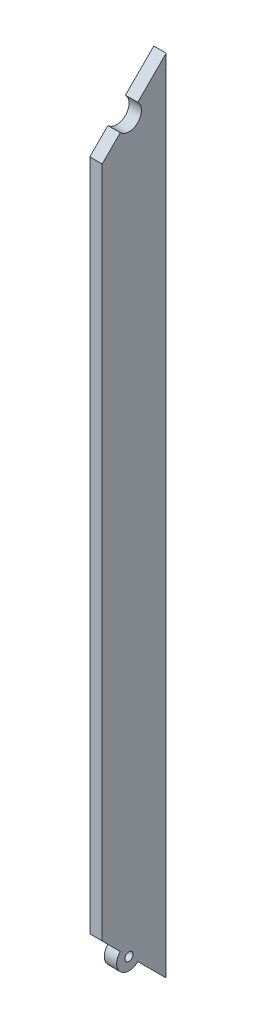
ISO-10303-21;
HEADER;
FILE_DESCRIPTION(('STEP AP214'),'2;1');
FILE_NAME('part.step','',(''),(''),'','','');
FILE_SCHEMA(('AUTOMOTIVE_DESIGN { 1 0 10303 214 1 1 1 1 }'));
ENDSEC;
DATA;
#1=APPLICATION_CONTEXT('core data for automotive mechanical design processes');
#2=APPLICATION_PROTOCOL_DEFINITION('international standard','automotive_design',2000,#1);
#3=PRODUCT_CONTEXT('',#1,'mechanical');
#4=PRODUCT('Part','Part','',(#3));
#5=PRODUCT_RELATED_PRODUCT_CATEGORY('part','',(#4));
#6=PRODUCT_DEFINITION_FORMATION('','',#4);
#7=PRODUCT_DEFINITION_CONTEXT('part definition',#1,'design');
#8=PRODUCT_DEFINITION('design','',#6,#7);
#9=PRODUCT_DEFINITION_SHAPE('','',#8);
#10=(LENGTH_UNIT() NAMED_UNIT(*) SI_UNIT(.MILLI.,.METRE.));
#11=(NAMED_UNIT(*) PLANE_ANGLE_UNIT() SI_UNIT($,.RADIAN.));
#12=(NAMED_UNIT(*) SI_UNIT($,.STERADIAN.) SOLID_ANGLE_UNIT());
#13=UNCERTAINTY_MEASURE_WITH_UNIT(LENGTH_MEASURE(1.E-05),#10,'distance_accuracy_value','');
#14=(GEOMETRIC_REPRESENTATION_CONTEXT(3) GLOBAL_UNCERTAINTY_ASSIGNED_CONTEXT((#13)) GLOBAL_UNIT_ASSIGNED_CONTEXT((#10,
#11,#12)) REPRESENTATION_CONTEXT('',''));
#15=CARTESIAN_POINT('',(0.,0.,0.));
#16=DIRECTION('',(0.,0.,1.));
#17=DIRECTION('',(1.,0.,0.));
#18=AXIS2_PLACEMENT_3D('',#15,#16,#17);
#19=CARTESIAN_POINT('',(6.,187.999999999998,188.));
#20=DIRECTION('',(0.,0.707106781186544,0.707106781186551));
#21=DIRECTION('',(0.,-0.707106781186551,0.707106781186544));
#22=AXIS2_PLACEMENT_3D('',#19,#20,#21);
#23=PLANE('',#22);
#24=DIRECTION('',(0.,0.707106781186552,-0.707106781186544));
#25=VECTOR('',#24,1.);
#26=CARTESIAN_POINT('',(0.,187.999999999998,188.));
#27=LINE('',#26,#25);
#28=CARTESIAN_POINT('',(0.,368.242640687119,7.75735931288074));
#29=VERTEX_POINT('',#28);
#30=CARTESIAN_POINT('',(0.,382.,-6.00000000000005));
#31=VERTEX_POINT('',#30);
#32=EDGE_CURVE('E118',#29,#31,#27,.T.);
#33=ORIENTED_EDGE('',*,*,#32,.F.);
#34=DIRECTION('',(-1.,0.,0.));
#35=VECTOR('',#34,1.);
#36=CARTESIAN_POINT('',(6.,368.242640687119,7.75735931288073));
#37=LINE('',#36,#35);
#38=CARTESIAN_POINT('',(6.,368.242640687119,7.75735931288075));
#39=VERTEX_POINT('',#38);
#40=EDGE_CURVE('E54',#29,#39,#37,.F.);
#41=ORIENTED_EDGE('',*,*,#40,.T.);
#42=DIRECTION('',(0.,0.707106781186552,-0.707106781186544));
#43=VECTOR('',#42,1.);
#44=CARTESIAN_POINT('',(6.,187.999999999998,188.));
#45=LINE('',#44,#43);
#46=CARTESIAN_POINT('',(6.,382.,-6.00000000000005));
#47=VERTEX_POINT('',#46);
#48=EDGE_CURVE('E116',#39,#47,#45,.T.);
#49=ORIENTED_EDGE('',*,*,#48,.T.);
#50=DIRECTION('',(-1.,0.,0.));
#51=VECTOR('',#50,1.);
#52=CARTESIAN_POINT('',(6.,382.,-6.00000000000005));
#53=LINE('',#52,#51);
#54=EDGE_CURVE('E148',#47,#31,#53,.T.);
#55=ORIENTED_EDGE('',*,*,#54,.T.);
#56=EDGE_LOOP('',(#33,#41,#49,#55));
#57=FACE_BOUND('',#56,.T.);
#58=ADVANCED_FACE('F41',(#57),#23,.T.);
#59=CARTESIAN_POINT('',(6.,351.,25.));
#60=VERTEX_POINT('',#59);
#61=CARTESIAN_POINT('',(6.,359.757359312881,16.2426406871193));
#62=VERTEX_POINT('',#61);
#63=EDGE_CURVE('E124',#60,#62,#45,.T.);
#64=ORIENTED_EDGE('',*,*,#63,.T.);
#65=DIRECTION('',(-1.,0.,0.));
#66=VECTOR('',#65,1.);
#67=CARTESIAN_POINT('',(6.,359.757359312881,16.2426406871193));
#68=LINE('',#67,#66);
#69=CARTESIAN_POINT('',(0.,359.757359312881,16.2426406871193));
#70=VERTEX_POINT('',#69);
#71=EDGE_CURVE('E108',#62,#70,#68,.T.);
#72=ORIENTED_EDGE('',*,*,#71,.T.);
#73=CARTESIAN_POINT('',(0.,351.,25.));
#74=VERTEX_POINT('',#73);
#75=EDGE_CURVE('E142',#74,#70,#27,.T.);
#76=ORIENTED_EDGE('',*,*,#75,.F.);
#77=DIRECTION('',(-1.,0.,0.));
#78=VECTOR('',#77,1.);
#79=CARTESIAN_POINT('',(6.,351.,25.));
#80=LINE('',#79,#78);
#81=EDGE_CURVE('E130',#60,#74,#80,.T.);
#82=ORIENTED_EDGE('',*,*,#81,.F.);
#83=EDGE_LOOP('',(#64,#72,#76,#82));
#84=FACE_BOUND('',#83,.T.);
#85=ADVANCED_FACE('F167',(#84),#23,.T.);
#86=CARTESIAN_POINT('',(6.,0.,0.));
#87=DIRECTION('',(0.,0.707106781186549,-0.707106781186546));
#88=DIRECTION('',(0.,0.707106781186546,0.707106781186549));
#89=AXIS2_PLACEMENT_3D('',#86,#87,#88);
#90=PLANE('',#89);
#91=DIRECTION('',(0.,-0.707106781186546,-0.707106781186549));
#92=VECTOR('',#91,1.);
#93=CARTESIAN_POINT('',(6.,0.,0.));
#94=LINE('',#93,#92);
#95=CARTESIAN_POINT('',(6.,7.75735931288067,7.7573593128807));
#96=VERTEX_POINT('',#95);
#97=CARTESIAN_POINT('',(6.,-6.00000000000002,-6.00000000000005));
#98=VERTEX_POINT('',#97);
#99=EDGE_CURVE('E177',#96,#98,#94,.T.);
#100=ORIENTED_EDGE('',*,*,#99,.F.);
#101=DIRECTION('',(-1.,0.,0.));
#102=VECTOR('',#101,1.);
#103=CARTESIAN_POINT('',(22.9705627484771,7.75735931288067,7.7573593128807));
#104=LINE('',#103,#102);
#105=CARTESIAN_POINT('',(0.,7.75735931288067,7.7573593128807));
#106=VERTEX_POINT('',#105);
#107=EDGE_CURVE('E139',#96,#106,#104,.T.);
#108=ORIENTED_EDGE('',*,*,#107,.T.);
#109=DIRECTION('',(0.,-0.707106781186546,-0.707106781186549));
#110=VECTOR('',#109,1.);
#111=CARTESIAN_POINT('',(0.,0.,0.));
#112=LINE('',#111,#110);
#113=CARTESIAN_POINT('',(0.,-6.00000000000002,-6.00000000000005));
#114=VERTEX_POINT('',#113);
#115=EDGE_CURVE('E133',#106,#114,#112,.T.);
#116=ORIENTED_EDGE('',*,*,#115,.T.);
#117=DIRECTION('',(-1.,0.,0.));
#118=VECTOR('',#117,1.);
#119=CARTESIAN_POINT('',(6.,-6.00000000000002,-6.00000000000005));
#120=LINE('',#119,#118);
#121=EDGE_CURVE('E149',#98,#114,#120,.T.);
#122=ORIENTED_EDGE('',*,*,#121,.F.);
#123=EDGE_LOOP('',(#100,#108,#116,#122));
#124=FACE_BOUND('',#123,.T.);
#125=ADVANCED_FACE('F174',(#124),#90,.F.);
#126=CARTESIAN_POINT('',(6.,0.,25.));
#127=DIRECTION('',(0.,0.,1.));
#128=DIRECTION('',(1.,0.,0.));
#129=AXIS2_PLACEMENT_3D('',#126,#127,#128);
#130=PLANE('',#129);
#131=DIRECTION('',(0.,1.,0.));
#132=VECTOR('',#131,1.);
#133=CARTESIAN_POINT('',(0.,0.,25.));
#134=LINE('',#133,#132);
#135=CARTESIAN_POINT('',(0.,24.9999999999999,25.));
#136=VERTEX_POINT('',#135);
#137=EDGE_CURVE('E135',#136,#74,#134,.T.);
#138=ORIENTED_EDGE('',*,*,#137,.F.);
#139=DIRECTION('',(-1.,0.,0.));
#140=VECTOR('',#139,1.);
#141=CARTESIAN_POINT('',(6.,24.9999999999999,25.));
#142=LINE('',#141,#140);
#143=CARTESIAN_POINT('',(6.,24.9999999999999,25.));
#144=VERTEX_POINT('',#143);
#145=EDGE_CURVE('E47',#144,#136,#142,.T.);
#146=ORIENTED_EDGE('',*,*,#145,.F.);
#147=DIRECTION('',(0.,1.,0.));
#148=VECTOR('',#147,1.);
#149=CARTESIAN_POINT('',(6.,0.,25.));
#150=LINE('',#149,#148);
#151=EDGE_CURVE('E146',#144,#60,#150,.T.);
#152=ORIENTED_EDGE('',*,*,#151,.T.);
#153=ORIENTED_EDGE('',*,*,#81,.T.);
#154=EDGE_LOOP('',(#138,#146,#152,#153));
#155=FACE_BOUND('',#154,.T.);
#156=ADVANCED_FACE('F43',(#155),#130,.T.);
#157=CARTESIAN_POINT('',(0.,16.2426406871192,16.2426406871193));
#158=VERTEX_POINT('',#157);
#159=EDGE_CURVE('E136',#136,#158,#112,.T.);
#160=ORIENTED_EDGE('',*,*,#159,.T.);
#161=DIRECTION('',(-1.,0.,0.));
#162=VECTOR('',#161,1.);
#163=CARTESIAN_POINT('',(22.9705627484771,16.2426406871192,16.2426406871193));
#164=LINE('',#163,#162);
#165=CARTESIAN_POINT('',(6.,16.2426406871192,16.2426406871193));
#166=VERTEX_POINT('',#165);
#167=EDGE_CURVE('E179',#158,#166,#164,.F.);
#168=ORIENTED_EDGE('',*,*,#167,.T.);
#169=EDGE_CURVE('E127',#144,#166,#94,.T.);
#170=ORIENTED_EDGE('',*,*,#169,.F.);
#171=ORIENTED_EDGE('',*,*,#145,.T.);
#172=EDGE_LOOP('',(#160,#168,#170,#171));
#173=FACE_BOUND('',#172,.T.);
#174=ADVANCED_FACE('F155',(#173),#90,.F.);
#175=CARTESIAN_POINT('',(6.,0.,-6.00000000000005));
#176=DIRECTION('',(0.,0.,1.));
#177=DIRECTION('',(0.,-1.,0.));
#178=AXIS2_PLACEMENT_3D('',#175,#176,#177);
#179=PLANE('',#178);
#180=DIRECTION('',(0.,1.,0.));
#181=VECTOR('',#180,1.);
#182=CARTESIAN_POINT('',(0.,0.,-6.00000000000005));
#183=LINE('',#182,#181);
#184=EDGE_CURVE('E137',#114,#31,#183,.T.);
#185=ORIENTED_EDGE('',*,*,#184,.T.);
#186=ORIENTED_EDGE('',*,*,#54,.F.);
#187=DIRECTION('',(0.,1.,0.));
#188=VECTOR('',#187,1.);
#189=CARTESIAN_POINT('',(6.,0.,-6.00000000000005));
#190=LINE('',#189,#188);
#191=EDGE_CURVE('E123',#98,#47,#190,.T.);
#192=ORIENTED_EDGE('',*,*,#191,.F.);
#193=ORIENTED_EDGE('',*,*,#121,.T.);
#194=EDGE_LOOP('',(#185,#186,#192,#193));
#195=FACE_BOUND('',#194,.T.);
#196=ADVANCED_FACE('F171',(#195),#179,.F.);
#197=CARTESIAN_POINT('',(6.,0.,0.));
#198=DIRECTION('',(1.,0.,0.));
#199=DIRECTION('',(0.,0.,-1.));
#200=AXIS2_PLACEMENT_3D('',#197,#198,#199);
#201=PLANE('',#200);
#202=CARTESIAN_POINT('',(6.,12.,12.));
#203=DIRECTION('',(1.,0.,0.));
#204=DIRECTION('',(0.,0.,-1.));
#205=AXIS2_PLACEMENT_3D('',#202,#203,#204);
#206=CIRCLE('',#205,1.99999999999995);
#207=CARTESIAN_POINT('',(6.,12.,10.));
#208=VERTEX_POINT('',#207);
#209=EDGE_CURVE('E188',#208,#208,#206,.T.);
#210=ORIENTED_EDGE('',*,*,#209,.F.);
#211=EDGE_LOOP('',(#210));
#212=FACE_BOUND('',#211,.T.);
#213=ORIENTED_EDGE('',*,*,#48,.F.);
#214=CARTESIAN_POINT('',(6.,364.,12.));
#215=DIRECTION('',(1.,0.,0.));
#216=DIRECTION('',(0.,0.,-1.));
#217=AXIS2_PLACEMENT_3D('',#214,#215,#216);
#218=CIRCLE('',#217,6.);
#219=EDGE_CURVE('E104',#62,#39,#218,.T.);
#220=ORIENTED_EDGE('',*,*,#219,.F.);
#221=ORIENTED_EDGE('',*,*,#63,.F.);
#222=ORIENTED_EDGE('',*,*,#151,.F.);
#223=ORIENTED_EDGE('',*,*,#169,.T.);
#224=CARTESIAN_POINT('',(6.,12.,12.));
#225=DIRECTION('',(1.,0.,0.));
#226=DIRECTION('',(0.,0.,-1.));
#227=AXIS2_PLACEMENT_3D('',#224,#225,#226);
#228=CIRCLE('',#227,6.);
#229=EDGE_CURVE('E65',#96,#166,#228,.F.);
#230=ORIENTED_EDGE('',*,*,#229,.F.);
#231=ORIENTED_EDGE('',*,*,#99,.T.);
#232=ORIENTED_EDGE('',*,*,#191,.T.);
#233=EDGE_LOOP('',(#213,#220,#221,#222,#223,#230,#231,#232));
#234=FACE_BOUND('',#233,.T.);
#235=ADVANCED_FACE('F121',(#212,#234),#201,.T.);
#236=CARTESIAN_POINT('',(0.,0.,0.));
#237=DIRECTION('',(1.,0.,0.));
#238=DIRECTION('',(0.,0.,-1.));
#239=AXIS2_PLACEMENT_3D('',#236,#237,#238);
#240=PLANE('',#239);
#241=CARTESIAN_POINT('',(0.,364.,12.));
#242=DIRECTION('',(1.,0.,0.));
#243=DIRECTION('',(0.,0.,-1.));
#244=AXIS2_PLACEMENT_3D('',#241,#242,#243);
#245=CIRCLE('',#244,6.);
#246=EDGE_CURVE('E11',#29,#70,#245,.F.);
#247=ORIENTED_EDGE('',*,*,#246,.F.);
#248=ORIENTED_EDGE('',*,*,#32,.T.);
#249=ORIENTED_EDGE('',*,*,#184,.F.);
#250=ORIENTED_EDGE('',*,*,#115,.F.);
#251=CARTESIAN_POINT('',(0.,12.,12.));
#252=DIRECTION('',(-1.,0.,0.));
#253=DIRECTION('',(0.,0.,1.));
#254=AXIS2_PLACEMENT_3D('',#251,#252,#253);
#255=CIRCLE('',#254,6.);
#256=EDGE_CURVE('E117',#106,#158,#255,.T.);
#257=ORIENTED_EDGE('',*,*,#256,.T.);
#258=ORIENTED_EDGE('',*,*,#159,.F.);
#259=ORIENTED_EDGE('',*,*,#137,.T.);
#260=ORIENTED_EDGE('',*,*,#75,.T.);
#261=EDGE_LOOP('',(#247,#248,#249,#250,#257,#258,#259,#260));
#262=FACE_BOUND('',#261,.T.);
#263=CARTESIAN_POINT('',(0.,12.,12.));
#264=DIRECTION('',(1.,0.,0.));
#265=DIRECTION('',(0.,0.,-1.));
#266=AXIS2_PLACEMENT_3D('',#263,#264,#265);
#267=CIRCLE('',#266,1.99999999999995);
#268=CARTESIAN_POINT('',(0.,12.,10.));
#269=VERTEX_POINT('',#268);
#270=EDGE_CURVE('E113',#269,#269,#267,.T.);
#271=ORIENTED_EDGE('',*,*,#270,.T.);
#272=EDGE_LOOP('',(#271));
#273=FACE_BOUND('',#272,.T.);
#274=ADVANCED_FACE('F165',(#262,#273),#240,.F.);
#275=CARTESIAN_POINT('',(22.9705627484771,12.,12.));
#276=DIRECTION('',(-1.,0.,0.));
#277=DIRECTION('',(0.,0.,1.));
#278=AXIS2_PLACEMENT_3D('',#275,#276,#277);
#279=CYLINDRICAL_SURFACE('',#278,6.);
#280=ORIENTED_EDGE('',*,*,#107,.F.);
#281=ORIENTED_EDGE('',*,*,#229,.T.);
#282=ORIENTED_EDGE('',*,*,#167,.F.);
#283=ORIENTED_EDGE('',*,*,#256,.F.);
#284=EDGE_LOOP('',(#280,#281,#282,#283));
#285=FACE_BOUND('',#284,.T.);
#286=ADVANCED_FACE('F192',(#285),#279,.T.);
#287=CARTESIAN_POINT('',(6.,12.,12.));
#288=DIRECTION('',(-1.,0.,0.));
#289=DIRECTION('',(0.,0.,1.));
#290=AXIS2_PLACEMENT_3D('',#287,#288,#289);
#291=CYLINDRICAL_SURFACE('',#290,1.99999999999995);
#292=ORIENTED_EDGE('',*,*,#209,.T.);
#293=EDGE_LOOP('',(#292));
#294=FACE_BOUND('',#293,.T.);
#295=ORIENTED_EDGE('',*,*,#270,.F.);
#296=EDGE_LOOP('',(#295));
#297=FACE_BOUND('',#296,.T.);
#298=ADVANCED_FACE('F195',(#294,#297),#291,.F.);
#299=CARTESIAN_POINT('',(6.,364.,12.));
#300=DIRECTION('',(-1.,0.,0.));
#301=DIRECTION('',(0.,0.,1.));
#302=AXIS2_PLACEMENT_3D('',#299,#300,#301);
#303=CYLINDRICAL_SURFACE('',#302,6.);
#304=ORIENTED_EDGE('',*,*,#246,.T.);
#305=ORIENTED_EDGE('',*,*,#71,.F.);
#306=ORIENTED_EDGE('',*,*,#219,.T.);
#307=ORIENTED_EDGE('',*,*,#40,.F.);
#308=EDGE_LOOP('',(#304,#305,#306,#307));
#309=FACE_BOUND('',#308,.T.);
#310=ADVANCED_FACE('F103',(#309),#303,.F.);
#311=CLOSED_SHELL('',(#58,#85,#125,#156,#174,#196,#235,#274,#286,#298,#310));
#312=MANIFOLD_SOLID_BREP('B2',#311);
#313=ADVANCED_BREP_SHAPE_REPRESENTATION('',(#18,#312),#14);
#314=SHAPE_DEFINITION_REPRESENTATION(#9,#313);
ENDSEC;
END-ISO-10303-21;
